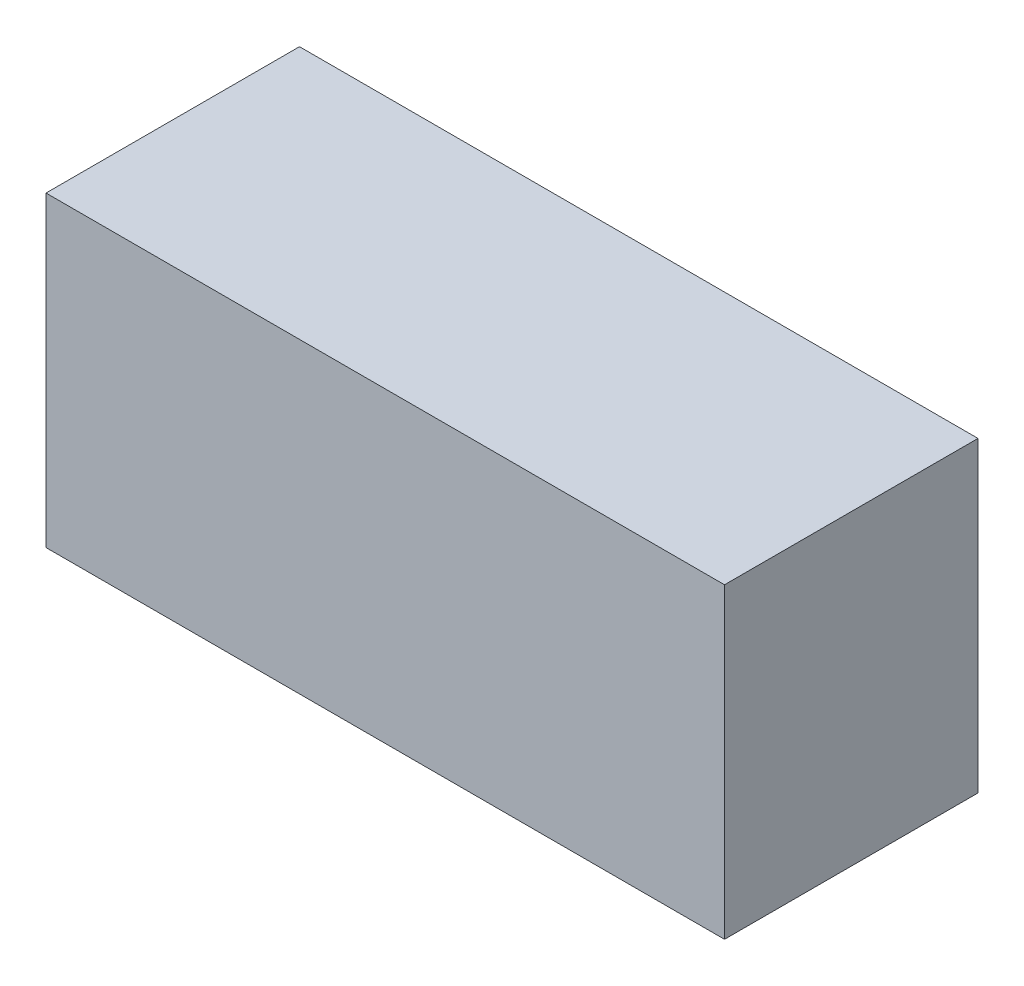
ISO-10303-21;
HEADER;
FILE_DESCRIPTION(('STEP AP214'),'2;1');
FILE_NAME('part.step','',(''),(''),'','','');
FILE_SCHEMA(('AUTOMOTIVE_DESIGN { 1 0 10303 214 1 1 1 1 }'));
ENDSEC;
DATA;
#1=APPLICATION_CONTEXT('core data for automotive mechanical design processes');
#2=APPLICATION_PROTOCOL_DEFINITION('international standard','automotive_design',2000,#1);
#3=PRODUCT_CONTEXT('',#1,'mechanical');
#4=PRODUCT('Part','Part','',(#3));
#5=PRODUCT_RELATED_PRODUCT_CATEGORY('part','',(#4));
#6=PRODUCT_DEFINITION_FORMATION('','',#4);
#7=PRODUCT_DEFINITION_CONTEXT('part definition',#1,'design');
#8=PRODUCT_DEFINITION('design','',#6,#7);
#9=PRODUCT_DEFINITION_SHAPE('','',#8);
#10=(LENGTH_UNIT() NAMED_UNIT(*) SI_UNIT(.MILLI.,.METRE.));
#11=(NAMED_UNIT(*) PLANE_ANGLE_UNIT() SI_UNIT($,.RADIAN.));
#12=(NAMED_UNIT(*) SI_UNIT($,.STERADIAN.) SOLID_ANGLE_UNIT());
#13=UNCERTAINTY_MEASURE_WITH_UNIT(LENGTH_MEASURE(1.E-05),#10,'distance_accuracy_value','');
#14=(GEOMETRIC_REPRESENTATION_CONTEXT(3) GLOBAL_UNCERTAINTY_ASSIGNED_CONTEXT((#13)) GLOBAL_UNIT_ASSIGNED_CONTEXT((#10,
#11,#12)) REPRESENTATION_CONTEXT('',''));
#15=CARTESIAN_POINT('',(0.,0.,0.));
#16=DIRECTION('',(0.,0.,1.));
#17=DIRECTION('',(1.,0.,0.));
#18=AXIS2_PLACEMENT_3D('',#15,#16,#17);
#19=CARTESIAN_POINT('',(-1.7399,0.7874,1.29999994));
#20=DIRECTION('',(0.,0.,1.));
#21=DIRECTION('',(1.,0.,0.));
#22=AXIS2_PLACEMENT_3D('',#19,#20,#21);
#23=PLANE('',#22);
#24=DIRECTION('',(0.,1.,0.));
#25=VECTOR('',#24,1.);
#26=CARTESIAN_POINT('',(1.7399,0.7874,1.29999994));
#27=LINE('',#26,#25);
#28=CARTESIAN_POINT('',(1.7399,0.7874,1.29999994));
#29=VERTEX_POINT('',#28);
#30=CARTESIAN_POINT('',(1.7399,-0.7874,1.29999994));
#31=VERTEX_POINT('',#30);
#32=EDGE_CURVE('E53',#29,#31,#27,.F.);
#33=ORIENTED_EDGE('',*,*,#32,.F.);
#34=DIRECTION('',(1.,0.,0.));
#35=VECTOR('',#34,1.);
#36=CARTESIAN_POINT('',(-1.7399,0.7874,1.29999994));
#37=LINE('',#36,#35);
#38=CARTESIAN_POINT('',(-1.7399,0.7874,1.29999994));
#39=VERTEX_POINT('',#38);
#40=EDGE_CURVE('E68',#39,#29,#37,.T.);
#41=ORIENTED_EDGE('',*,*,#40,.F.);
#42=DIRECTION('',(0.,1.,0.));
#43=VECTOR('',#42,1.);
#44=CARTESIAN_POINT('',(-1.7399,-0.7874,1.29999994));
#45=LINE('',#44,#43);
#46=CARTESIAN_POINT('',(-1.7399,-0.7874,1.29999994));
#47=VERTEX_POINT('',#46);
#48=EDGE_CURVE('E20',#47,#39,#45,.T.);
#49=ORIENTED_EDGE('',*,*,#48,.F.);
#50=DIRECTION('',(1.,0.,0.));
#51=VECTOR('',#50,1.);
#52=CARTESIAN_POINT('',(1.7399,-0.7874,1.29999994));
#53=LINE('',#52,#51);
#54=EDGE_CURVE('E58',#31,#47,#53,.F.);
#55=ORIENTED_EDGE('',*,*,#54,.F.);
#56=EDGE_LOOP('',(#33,#41,#49,#55));
#57=FACE_BOUND('',#56,.T.);
#58=ADVANCED_FACE('F17',(#57),#23,.T.);
#59=CARTESIAN_POINT('',(-1.7399,-0.7874,0.));
#60=DIRECTION('',(-1.,0.,0.));
#61=DIRECTION('',(0.,0.,1.));
#62=AXIS2_PLACEMENT_3D('',#59,#60,#61);
#63=PLANE('',#62);
#64=DIRECTION('',(0.,0.,1.));
#65=VECTOR('',#64,1.);
#66=CARTESIAN_POINT('',(-1.7399,0.7874,0.));
#67=LINE('',#66,#65);
#68=CARTESIAN_POINT('',(-1.7399,0.7874,0.));
#69=VERTEX_POINT('',#68);
#70=EDGE_CURVE('E79',#69,#39,#67,.T.);
#71=ORIENTED_EDGE('',*,*,#70,.F.);
#72=DIRECTION('',(0.,1.,0.));
#73=VECTOR('',#72,1.);
#74=CARTESIAN_POINT('',(-1.7399,0.7874,0.));
#75=LINE('',#74,#73);
#76=CARTESIAN_POINT('',(-1.7399,-0.7874,0.));
#77=VERTEX_POINT('',#76);
#78=EDGE_CURVE('E74',#69,#77,#75,.F.);
#79=ORIENTED_EDGE('',*,*,#78,.T.);
#80=DIRECTION('',(0.,0.,-1.));
#81=VECTOR('',#80,1.);
#82=CARTESIAN_POINT('',(-1.7399,-0.7874,0.));
#83=LINE('',#82,#81);
#84=EDGE_CURVE('E63',#47,#77,#83,.T.);
#85=ORIENTED_EDGE('',*,*,#84,.F.);
#86=ORIENTED_EDGE('',*,*,#48,.T.);
#87=EDGE_LOOP('',(#71,#79,#85,#86));
#88=FACE_BOUND('',#87,.T.);
#89=ADVANCED_FACE('F73',(#88),#63,.T.);
#90=CARTESIAN_POINT('',(1.7399,-0.7874,0.));
#91=DIRECTION('',(0.,-1.,0.));
#92=DIRECTION('',(0.,0.,-1.));
#93=AXIS2_PLACEMENT_3D('',#90,#91,#92);
#94=PLANE('',#93);
#95=ORIENTED_EDGE('',*,*,#84,.T.);
#96=DIRECTION('',(1.,0.,0.));
#97=VECTOR('',#96,1.);
#98=CARTESIAN_POINT('',(-1.7399,-0.7874,0.));
#99=LINE('',#98,#97);
#100=CARTESIAN_POINT('',(1.7399,-0.7874,0.));
#101=VERTEX_POINT('',#100);
#102=EDGE_CURVE('E84',#77,#101,#99,.T.);
#103=ORIENTED_EDGE('',*,*,#102,.T.);
#104=DIRECTION('',(0.,0.,-1.));
#105=VECTOR('',#104,1.);
#106=CARTESIAN_POINT('',(1.7399,-0.7874,0.));
#107=LINE('',#106,#105);
#108=EDGE_CURVE('E65',#31,#101,#107,.T.);
#109=ORIENTED_EDGE('',*,*,#108,.F.);
#110=ORIENTED_EDGE('',*,*,#54,.T.);
#111=EDGE_LOOP('',(#95,#103,#109,#110));
#112=FACE_BOUND('',#111,.T.);
#113=ADVANCED_FACE('F60',(#112),#94,.T.);
#114=CARTESIAN_POINT('',(1.7399,0.7874,0.));
#115=DIRECTION('',(1.,0.,0.));
#116=DIRECTION('',(0.,0.,-1.));
#117=AXIS2_PLACEMENT_3D('',#114,#115,#116);
#118=PLANE('',#117);
#119=ORIENTED_EDGE('',*,*,#108,.T.);
#120=DIRECTION('',(0.,1.,0.));
#121=VECTOR('',#120,1.);
#122=CARTESIAN_POINT('',(1.7399,0.7874,0.));
#123=LINE('',#122,#121);
#124=CARTESIAN_POINT('',(1.7399,0.7874,0.));
#125=VERTEX_POINT('',#124);
#126=EDGE_CURVE('E26',#101,#125,#123,.T.);
#127=ORIENTED_EDGE('',*,*,#126,.T.);
#128=DIRECTION('',(0.,0.,1.));
#129=VECTOR('',#128,1.);
#130=CARTESIAN_POINT('',(1.7399,0.7874,0.));
#131=LINE('',#130,#129);
#132=EDGE_CURVE('E34',#29,#125,#131,.F.);
#133=ORIENTED_EDGE('',*,*,#132,.F.);
#134=ORIENTED_EDGE('',*,*,#32,.T.);
#135=EDGE_LOOP('',(#119,#127,#133,#134));
#136=FACE_BOUND('',#135,.T.);
#137=ADVANCED_FACE('F88',(#136),#118,.T.);
#138=CARTESIAN_POINT('',(-1.7399,0.7874,0.));
#139=DIRECTION('',(0.,1.,0.));
#140=DIRECTION('',(0.,0.,1.));
#141=AXIS2_PLACEMENT_3D('',#138,#139,#140);
#142=PLANE('',#141);
#143=ORIENTED_EDGE('',*,*,#132,.T.);
#144=DIRECTION('',(1.,0.,0.));
#145=VECTOR('',#144,1.);
#146=CARTESIAN_POINT('',(-1.7399,0.7874,0.));
#147=LINE('',#146,#145);
#148=EDGE_CURVE('E11',#125,#69,#147,.F.);
#149=ORIENTED_EDGE('',*,*,#148,.T.);
#150=ORIENTED_EDGE('',*,*,#70,.T.);
#151=ORIENTED_EDGE('',*,*,#40,.T.);
#152=EDGE_LOOP('',(#143,#149,#150,#151));
#153=FACE_BOUND('',#152,.T.);
#154=ADVANCED_FACE('F91',(#153),#142,.T.);
#155=CARTESIAN_POINT('',(-1.7399,0.7874,0.));
#156=DIRECTION('',(0.,0.,1.));
#157=DIRECTION('',(1.,0.,0.));
#158=AXIS2_PLACEMENT_3D('',#155,#156,#157);
#159=PLANE('',#158);
#160=ORIENTED_EDGE('',*,*,#126,.F.);
#161=ORIENTED_EDGE('',*,*,#102,.F.);
#162=ORIENTED_EDGE('',*,*,#78,.F.);
#163=ORIENTED_EDGE('',*,*,#148,.F.);
#164=EDGE_LOOP('',(#160,#161,#162,#163));
#165=FACE_BOUND('',#164,.T.);
#166=ADVANCED_FACE('F90',(#165),#159,.F.);
#167=CLOSED_SHELL('',(#58,#89,#113,#137,#154,#166));
#168=MANIFOLD_SOLID_BREP('B1',#167);
#169=ADVANCED_BREP_SHAPE_REPRESENTATION('',(#18,#168),#14);
#170=SHAPE_DEFINITION_REPRESENTATION(#9,#169);
ENDSEC;
END-ISO-10303-21;
